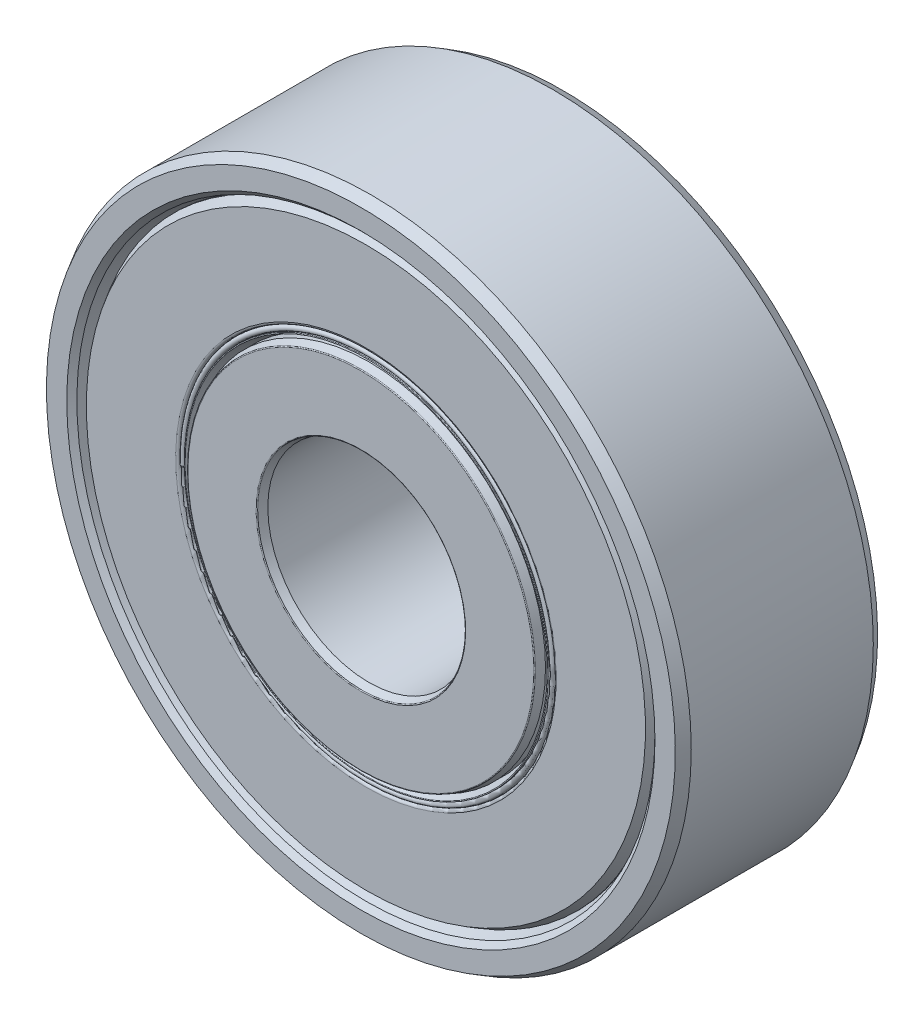
ISO-10303-21;
HEADER;
FILE_DESCRIPTION(('STEP AP214'),'2;1');
FILE_NAME('part.step','',(''),(''),'','','');
FILE_SCHEMA(('AUTOMOTIVE_DESIGN { 1 0 10303 214 1 1 1 1 }'));
ENDSEC;
DATA;
#1=APPLICATION_CONTEXT('core data for automotive mechanical design processes');
#2=APPLICATION_PROTOCOL_DEFINITION('international standard','automotive_design',2000,#1);
#3=PRODUCT_CONTEXT('',#1,'mechanical');
#4=PRODUCT('Part','Part','',(#3));
#5=PRODUCT_RELATED_PRODUCT_CATEGORY('part','',(#4));
#6=PRODUCT_DEFINITION_FORMATION('','',#4);
#7=PRODUCT_DEFINITION_CONTEXT('part definition',#1,'design');
#8=PRODUCT_DEFINITION('design','',#6,#7);
#9=PRODUCT_DEFINITION_SHAPE('','',#8);
#10=(LENGTH_UNIT() NAMED_UNIT(*) SI_UNIT(.MILLI.,.METRE.));
#11=(NAMED_UNIT(*) PLANE_ANGLE_UNIT() SI_UNIT($,.RADIAN.));
#12=(NAMED_UNIT(*) SI_UNIT($,.STERADIAN.) SOLID_ANGLE_UNIT());
#13=UNCERTAINTY_MEASURE_WITH_UNIT(LENGTH_MEASURE(1.E-05),#10,'distance_accuracy_value','');
#14=(GEOMETRIC_REPRESENTATION_CONTEXT(3) GLOBAL_UNCERTAINTY_ASSIGNED_CONTEXT((#13)) GLOBAL_UNIT_ASSIGNED_CONTEXT((#10,
#11,#12)) REPRESENTATION_CONTEXT('',''));
#15=CARTESIAN_POINT('',(0.,0.,0.));
#16=DIRECTION('',(0.,0.,1.));
#17=DIRECTION('',(1.,0.,0.));
#18=AXIS2_PLACEMENT_3D('',#15,#16,#17);
#19=CARTESIAN_POINT('',(0.,0.,3.));
#20=DIRECTION('',(0.,0.,1.));
#21=DIRECTION('',(0.,-1.,0.));
#22=AXIS2_PLACEMENT_3D('',#19,#20,#21);
#23=CYLINDRICAL_SURFACE('',#22,5.56201387559809);
#24=CARTESIAN_POINT('',(0.,0.,-2.13149306220096));
#25=DIRECTION('',(0.,0.,1.));
#26=DIRECTION('',(0.,-1.,0.));
#27=AXIS2_PLACEMENT_3D('',#24,#25,#26);
#28=CIRCLE('',#27,5.56201387559809);
#29=CARTESIAN_POINT('',(0.,-5.56201387559809,-2.13149306220096));
#30=VERTEX_POINT('',#29);
#31=EDGE_CURVE('E11',#30,#30,#28,.T.);
#32=ORIENTED_EDGE('',*,*,#31,.F.);
#33=EDGE_LOOP('',(#32));
#34=FACE_BOUND('',#33,.T.);
#35=CARTESIAN_POINT('',(0.,0.,-2.76875000000001));
#36=DIRECTION('',(0.,0.,1.));
#37=DIRECTION('',(0.,-1.,0.));
#38=AXIS2_PLACEMENT_3D('',#35,#36,#37);
#39=CIRCLE('',#38,5.56201387559809);
#40=CARTESIAN_POINT('',(0.,-5.56201387559809,-2.76875000000001));
#41=VERTEX_POINT('',#40);
#42=EDGE_CURVE('E77',#41,#41,#39,.T.);
#43=ORIENTED_EDGE('',*,*,#42,.T.);
#44=EDGE_LOOP('',(#43));
#45=FACE_BOUND('',#44,.T.);
#46=ADVANCED_FACE('F52',(#34,#45),#23,.T.);
#47=CARTESIAN_POINT('',(0.,5.56201387559809,-2.13149306220096));
#48=DIRECTION('',(0.,0.,-1.));
#49=DIRECTION('',(0.,1.,0.));
#50=AXIS2_PLACEMENT_3D('',#47,#48,#49);
#51=PLANE('',#50);
#52=CARTESIAN_POINT('',(0.,0.,-2.13149306220096));
#53=DIRECTION('',(0.,0.,1.));
#54=DIRECTION('',(0.,-1.,0.));
#55=AXIS2_PLACEMENT_3D('',#52,#53,#54);
#56=CIRCLE('',#55,5.23701387559809);
#57=CARTESIAN_POINT('',(0.,-5.23701387559809,-2.13149306220096));
#58=VERTEX_POINT('',#57);
#59=EDGE_CURVE('E58',#58,#58,#56,.T.);
#60=ORIENTED_EDGE('',*,*,#59,.F.);
#61=EDGE_LOOP('',(#60));
#62=FACE_BOUND('',#61,.T.);
#63=ORIENTED_EDGE('',*,*,#31,.T.);
#64=EDGE_LOOP('',(#63));
#65=FACE_BOUND('',#64,.T.);
#66=ADVANCED_FACE('F108',(#62,#65),#51,.F.);
#67=CARTESIAN_POINT('',(0.,0.,3.));
#68=DIRECTION('',(0.,0.,1.));
#69=DIRECTION('',(0.,-1.,0.));
#70=AXIS2_PLACEMENT_3D('',#67,#68,#69);
#71=CYLINDRICAL_SURFACE('',#70,5.23701387559809);
#72=CARTESIAN_POINT('',(0.,0.,-2.47360414663289));
#73=DIRECTION('',(0.,0.,1.));
#74=DIRECTION('',(0.,-1.,0.));
#75=AXIS2_PLACEMENT_3D('',#72,#73,#74);
#76=CIRCLE('',#75,5.23701387559809);
#77=CARTESIAN_POINT('',(0.,-5.23701387559809,-2.47360414663289));
#78=VERTEX_POINT('',#77);
#79=EDGE_CURVE('E62',#78,#78,#76,.T.);
#80=ORIENTED_EDGE('',*,*,#79,.F.);
#81=EDGE_LOOP('',(#80));
#82=FACE_BOUND('',#81,.T.);
#83=ORIENTED_EDGE('',*,*,#59,.T.);
#84=EDGE_LOOP('',(#83));
#85=FACE_BOUND('',#84,.T.);
#86=ADVANCED_FACE('F103',(#82,#85),#71,.F.);
#87=CARTESIAN_POINT('',(0.,0.,-2.47360414663289));
#88=DIRECTION('',(0.,0.,-1.));
#89=DIRECTION('',(0.,1.,0.));
#90=AXIS2_PLACEMENT_3D('',#87,#88,#89);
#91=CONICAL_SURFACE('',#90,5.23701387559809,0.349065850398866);
#92=CARTESIAN_POINT('',(0.,0.,-2.84013030214989));
#93=DIRECTION('',(0.,0.,1.));
#94=DIRECTION('',(0.,-1.,0.));
#95=AXIS2_PLACEMENT_3D('',#92,#93,#94);
#96=CIRCLE('',#95,5.3704184862863);
#97=CARTESIAN_POINT('',(0.,-5.3704184862863,-2.84013030214989));
#98=VERTEX_POINT('',#97);
#99=EDGE_CURVE('E66',#98,#98,#96,.T.);
#100=ORIENTED_EDGE('',*,*,#99,.F.);
#101=EDGE_LOOP('',(#100));
#102=FACE_BOUND('',#101,.T.);
#103=ORIENTED_EDGE('',*,*,#79,.T.);
#104=EDGE_LOOP('',(#103));
#105=FACE_BOUND('',#104,.T.);
#106=ADVANCED_FACE('F97',(#102,#105),#91,.F.);
#107=CARTESIAN_POINT('',(0.,0.,-2.835));
#108=DIRECTION('',(0.,0.,1.));
#109=DIRECTION('',(0.,-1.,0.));
#110=AXIS2_PLACEMENT_3D('',#107,#108,#109);
#111=TOROIDAL_SURFACE('',#110,5.38451387559809,0.0149999999999995);
#112=CARTESIAN_POINT('',(0.,0.,-2.835));
#113=DIRECTION('',(0.,0.,1.));
#114=DIRECTION('',(0.,-1.,0.));
#115=AXIS2_PLACEMENT_3D('',#112,#113,#114);
#116=CIRCLE('',#115,5.39951387559809);
#117=CARTESIAN_POINT('',(0.,-5.39951387559809,-2.835));
#118=VERTEX_POINT('',#117);
#119=EDGE_CURVE('E71',#118,#118,#116,.T.);
#120=ORIENTED_EDGE('',*,*,#119,.F.);
#121=EDGE_LOOP('',(#120));
#122=FACE_BOUND('',#121,.T.);
#123=ORIENTED_EDGE('',*,*,#99,.T.);
#124=EDGE_LOOP('',(#123));
#125=FACE_BOUND('',#124,.T.);
#126=ADVANCED_FACE('F91',(#122,#125),#111,.T.);
#127=CARTESIAN_POINT('',(0.,0.,3.));
#128=DIRECTION('',(0.,0.,1.));
#129=DIRECTION('',(0.,-1.,0.));
#130=AXIS2_PLACEMENT_3D('',#127,#128,#129);
#131=CYLINDRICAL_SURFACE('',#130,5.39951387559809);
#132=CARTESIAN_POINT('',(0.,0.,-2.76875000000001));
#133=DIRECTION('',(0.,0.,1.));
#134=DIRECTION('',(0.,-1.,0.));
#135=AXIS2_PLACEMENT_3D('',#132,#133,#134);
#136=CIRCLE('',#135,5.39951387559809);
#137=CARTESIAN_POINT('',(0.,-5.39951387559809,-2.76875000000001));
#138=VERTEX_POINT('',#137);
#139=EDGE_CURVE('E74',#138,#138,#136,.T.);
#140=ORIENTED_EDGE('',*,*,#139,.F.);
#141=EDGE_LOOP('',(#140));
#142=FACE_BOUND('',#141,.T.);
#143=ORIENTED_EDGE('',*,*,#119,.T.);
#144=EDGE_LOOP('',(#143));
#145=FACE_BOUND('',#144,.T.);
#146=ADVANCED_FACE('F85',(#142,#145),#131,.T.);
#147=CARTESIAN_POINT('',(0.,0.,-2.76875000000001));
#148=DIRECTION('',(0.,0.,1.));
#149=DIRECTION('',(0.,-1.,0.));
#150=AXIS2_PLACEMENT_3D('',#147,#148,#149);
#151=TOROIDAL_SURFACE('',#150,5.48076387559809,0.0812499999999997);
#152=ORIENTED_EDGE('',*,*,#42,.F.);
#153=EDGE_LOOP('',(#152));
#154=FACE_BOUND('',#153,.T.);
#155=ORIENTED_EDGE('',*,*,#139,.T.);
#156=EDGE_LOOP('',(#155));
#157=FACE_BOUND('',#156,.T.);
#158=ADVANCED_FACE('F82',(#154,#157),#151,.T.);
#159=CLOSED_SHELL('',(#46,#66,#86,#106,#126,#146,#158));
#160=MANIFOLD_SOLID_BREP('B2',#159);
#161=CARTESIAN_POINT('',(0.,5.56201387559809,2.13149306220096));
#162=DIRECTION('',(0.,0.,1.));
#163=DIRECTION('',(0.,-1.,0.));
#164=AXIS2_PLACEMENT_3D('',#161,#162,#163);
#165=PLANE('',#164);
#166=CARTESIAN_POINT('',(0.,0.,2.13149306220096));
#167=DIRECTION('',(0.,0.,1.));
#168=DIRECTION('',(0.,-1.,0.));
#169=AXIS2_PLACEMENT_3D('',#166,#167,#168);
#170=CIRCLE('',#169,5.56201387559809);
#171=CARTESIAN_POINT('',(0.,-5.56201387559809,2.13149306220095));
#172=VERTEX_POINT('',#171);
#173=EDGE_CURVE('E178',#172,#172,#170,.T.);
#174=ORIENTED_EDGE('',*,*,#173,.F.);
#175=EDGE_LOOP('',(#174));
#176=FACE_BOUND('',#175,.T.);
#177=CARTESIAN_POINT('',(0.,0.,2.13149306220096));
#178=DIRECTION('',(0.,0.,1.));
#179=DIRECTION('',(0.,-1.,0.));
#180=AXIS2_PLACEMENT_3D('',#177,#178,#179);
#181=CIRCLE('',#180,5.23701387559809);
#182=CARTESIAN_POINT('',(0.,-5.23701387559809,2.13149306220095));
#183=VERTEX_POINT('',#182);
#184=EDGE_CURVE('E51',#183,#183,#181,.T.);
#185=ORIENTED_EDGE('',*,*,#184,.T.);
#186=EDGE_LOOP('',(#185));
#187=FACE_BOUND('',#186,.T.);
#188=ADVANCED_FACE('F153',(#176,#187),#165,.F.);
#189=CARTESIAN_POINT('',(0.,0.,3.));
#190=DIRECTION('',(0.,0.,1.));
#191=DIRECTION('',(0.,-1.,0.));
#192=AXIS2_PLACEMENT_3D('',#189,#190,#191);
#193=CYLINDRICAL_SURFACE('',#192,5.23701387559809);
#194=ORIENTED_EDGE('',*,*,#184,.F.);
#195=EDGE_LOOP('',(#194));
#196=FACE_BOUND('',#195,.T.);
#197=CARTESIAN_POINT('',(0.,0.,2.47360414663289));
#198=DIRECTION('',(0.,0.,1.));
#199=DIRECTION('',(0.,-1.,0.));
#200=AXIS2_PLACEMENT_3D('',#197,#198,#199);
#201=CIRCLE('',#200,5.23701387559809);
#202=CARTESIAN_POINT('',(0.,-5.23701387559809,2.47360414663289));
#203=VERTEX_POINT('',#202);
#204=EDGE_CURVE('E159',#203,#203,#201,.T.);
#205=ORIENTED_EDGE('',*,*,#204,.T.);
#206=EDGE_LOOP('',(#205));
#207=FACE_BOUND('',#206,.T.);
#208=ADVANCED_FACE('F185',(#196,#207),#193,.F.);
#209=CARTESIAN_POINT('',(0.,0.,2.84013030214989));
#210=DIRECTION('',(0.,0.,1.));
#211=DIRECTION('',(0.,-1.,0.));
#212=AXIS2_PLACEMENT_3D('',#209,#210,#211);
#213=CONICAL_SURFACE('',#212,5.3704184862863,0.349065850398866);
#214=ORIENTED_EDGE('',*,*,#204,.F.);
#215=EDGE_LOOP('',(#214));
#216=FACE_BOUND('',#215,.T.);
#217=CARTESIAN_POINT('',(0.,0.,2.84013030214989));
#218=DIRECTION('',(0.,0.,1.));
#219=DIRECTION('',(0.,-1.,0.));
#220=AXIS2_PLACEMENT_3D('',#217,#218,#219);
#221=CIRCLE('',#220,5.3704184862863);
#222=CARTESIAN_POINT('',(0.,-5.3704184862863,2.84013030214989));
#223=VERTEX_POINT('',#222);
#224=EDGE_CURVE('E163',#223,#223,#221,.T.);
#225=ORIENTED_EDGE('',*,*,#224,.T.);
#226=EDGE_LOOP('',(#225));
#227=FACE_BOUND('',#226,.T.);
#228=ADVANCED_FACE('F189',(#216,#227),#213,.F.);
#229=CARTESIAN_POINT('',(0.,0.,2.835));
#230=DIRECTION('',(0.,0.,1.));
#231=DIRECTION('',(0.,-1.,0.));
#232=AXIS2_PLACEMENT_3D('',#229,#230,#231);
#233=TOROIDAL_SURFACE('',#232,5.38451387559809,0.0149999999999995);
#234=ORIENTED_EDGE('',*,*,#224,.F.);
#235=EDGE_LOOP('',(#234));
#236=FACE_BOUND('',#235,.T.);
#237=CARTESIAN_POINT('',(0.,0.,2.835));
#238=DIRECTION('',(0.,0.,1.));
#239=DIRECTION('',(0.,-1.,0.));
#240=AXIS2_PLACEMENT_3D('',#237,#238,#239);
#241=CIRCLE('',#240,5.39951387559809);
#242=CARTESIAN_POINT('',(0.,-5.39951387559809,2.835));
#243=VERTEX_POINT('',#242);
#244=EDGE_CURVE('E167',#243,#243,#241,.T.);
#245=ORIENTED_EDGE('',*,*,#244,.T.);
#246=EDGE_LOOP('',(#245));
#247=FACE_BOUND('',#246,.T.);
#248=ADVANCED_FACE('F194',(#236,#247),#233,.T.);
#249=CARTESIAN_POINT('',(0.,0.,3.));
#250=DIRECTION('',(0.,0.,1.));
#251=DIRECTION('',(0.,-1.,0.));
#252=AXIS2_PLACEMENT_3D('',#249,#250,#251);
#253=CYLINDRICAL_SURFACE('',#252,5.39951387559809);
#254=ORIENTED_EDGE('',*,*,#244,.F.);
#255=EDGE_LOOP('',(#254));
#256=FACE_BOUND('',#255,.T.);
#257=CARTESIAN_POINT('',(0.,0.,2.76875));
#258=DIRECTION('',(0.,0.,1.));
#259=DIRECTION('',(0.,-1.,0.));
#260=AXIS2_PLACEMENT_3D('',#257,#258,#259);
#261=CIRCLE('',#260,5.39951387559809);
#262=CARTESIAN_POINT('',(0.,-5.39951387559809,2.76875));
#263=VERTEX_POINT('',#262);
#264=EDGE_CURVE('E172',#263,#263,#261,.T.);
#265=ORIENTED_EDGE('',*,*,#264,.T.);
#266=EDGE_LOOP('',(#265));
#267=FACE_BOUND('',#266,.T.);
#268=ADVANCED_FACE('F200',(#256,#267),#253,.T.);
#269=CARTESIAN_POINT('',(0.,0.,2.76875));
#270=DIRECTION('',(0.,0.,1.));
#271=DIRECTION('',(0.,-1.,0.));
#272=AXIS2_PLACEMENT_3D('',#269,#270,#271);
#273=TOROIDAL_SURFACE('',#272,5.48076387559809,0.0812499999999997);
#274=ORIENTED_EDGE('',*,*,#264,.F.);
#275=EDGE_LOOP('',(#274));
#276=FACE_BOUND('',#275,.T.);
#277=CARTESIAN_POINT('',(0.,0.,2.76875));
#278=DIRECTION('',(0.,0.,1.));
#279=DIRECTION('',(0.,-1.,0.));
#280=AXIS2_PLACEMENT_3D('',#277,#278,#279);
#281=CIRCLE('',#280,5.56201387559809);
#282=CARTESIAN_POINT('',(0.,-5.56201387559809,2.76875));
#283=VERTEX_POINT('',#282);
#284=EDGE_CURVE('E175',#283,#283,#281,.T.);
#285=ORIENTED_EDGE('',*,*,#284,.T.);
#286=EDGE_LOOP('',(#285));
#287=FACE_BOUND('',#286,.T.);
#288=ADVANCED_FACE('F204',(#276,#287),#273,.T.);
#289=CARTESIAN_POINT('',(0.,0.,3.));
#290=DIRECTION('',(0.,0.,1.));
#291=DIRECTION('',(0.,-1.,0.));
#292=AXIS2_PLACEMENT_3D('',#289,#290,#291);
#293=CYLINDRICAL_SURFACE('',#292,5.56201387559809);
#294=ORIENTED_EDGE('',*,*,#284,.F.);
#295=EDGE_LOOP('',(#294));
#296=FACE_BOUND('',#295,.T.);
#297=ORIENTED_EDGE('',*,*,#173,.T.);
#298=EDGE_LOOP('',(#297));
#299=FACE_BOUND('',#298,.T.);
#300=ADVANCED_FACE('F182',(#296,#299),#293,.T.);
#301=CLOSED_SHELL('',(#188,#208,#228,#248,#268,#288,#300));
#302=MANIFOLD_SOLID_BREP('B6',#301);
#303=CARTESIAN_POINT('',(0.,0.,-2.85));
#304=DIRECTION('',(0.,0.,1.));
#305=DIRECTION('',(0.,-1.,0.));
#306=AXIS2_PLACEMENT_3D('',#303,#304,#305);
#307=CONICAL_SURFACE('',#306,8.2925,0.523598775598293);
#308=CARTESIAN_POINT('',(0.,0.,-2.56854174377006));
#309=DIRECTION('',(0.,0.,1.));
#310=DIRECTION('',(0.,-1.,0.));
#311=AXIS2_PLACEMENT_3D('',#308,#309,#310);
#312=CIRCLE('',#311,8.455);
#313=CARTESIAN_POINT('',(0.,-8.455,-2.56854174377006));
#314=VERTEX_POINT('',#313);
#315=EDGE_CURVE('E276',#314,#314,#312,.T.);
#316=ORIENTED_EDGE('',*,*,#315,.F.);
#317=EDGE_LOOP('',(#316));
#318=FACE_BOUND('',#317,.T.);
#319=CARTESIAN_POINT('',(0.,0.,-2.85));
#320=DIRECTION('',(0.,0.,1.));
#321=DIRECTION('',(0.,-1.,0.));
#322=AXIS2_PLACEMENT_3D('',#319,#320,#321);
#323=CIRCLE('',#322,8.2925);
#324=CARTESIAN_POINT('',(0.,-8.2925,-2.85000000000001));
#325=VERTEX_POINT('',#324);
#326=EDGE_CURVE('E152',#325,#325,#323,.T.);
#327=ORIENTED_EDGE('',*,*,#326,.T.);
#328=EDGE_LOOP('',(#327));
#329=FACE_BOUND('',#328,.T.);
#330=ADVANCED_FACE('F254',(#318,#329),#307,.T.);
#331=CARTESIAN_POINT('',(0.,8.2925,-2.85));
#332=DIRECTION('',(0.,0.,1.));
#333=DIRECTION('',(0.,-1.,0.));
#334=AXIS2_PLACEMENT_3D('',#331,#332,#333);
#335=PLANE('',#334);
#336=ORIENTED_EDGE('',*,*,#326,.F.);
#337=EDGE_LOOP('',(#336));
#338=FACE_BOUND('',#337,.T.);
#339=CARTESIAN_POINT('',(0.,0.,-2.85));
#340=DIRECTION('',(0.,0.,1.));
#341=DIRECTION('',(0.,-1.,0.));
#342=AXIS2_PLACEMENT_3D('',#339,#340,#341);
#343=CIRCLE('',#342,5.64326387559809);
#344=CARTESIAN_POINT('',(0.,-5.64326387559809,-2.85000000000001));
#345=VERTEX_POINT('',#344);
#346=EDGE_CURVE('E260',#345,#345,#343,.T.);
#347=ORIENTED_EDGE('',*,*,#346,.T.);
#348=EDGE_LOOP('',(#347));
#349=FACE_BOUND('',#348,.T.);
#350=ADVANCED_FACE('F283',(#338,#349),#335,.F.);
#351=CARTESIAN_POINT('',(0.,0.,-2.76875));
#352=DIRECTION('',(0.,0.,1.));
#353=DIRECTION('',(0.,-1.,0.));
#354=AXIS2_PLACEMENT_3D('',#351,#352,#353);
#355=TOROIDAL_SURFACE('',#354,5.64326387559809,0.0812500000000008);
#356=ORIENTED_EDGE('',*,*,#346,.F.);
#357=EDGE_LOOP('',(#356));
#358=FACE_BOUND('',#357,.T.);
#359=CARTESIAN_POINT('',(0.,0.,-2.76875));
#360=DIRECTION('',(0.,0.,1.));
#361=DIRECTION('',(0.,-1.,0.));
#362=AXIS2_PLACEMENT_3D('',#359,#360,#361);
#363=CIRCLE('',#362,5.56201387559809);
#364=CARTESIAN_POINT('',(0.,-5.56201387559809,-2.76875));
#365=VERTEX_POINT('',#364);
#366=EDGE_CURVE('E264',#365,#365,#363,.T.);
#367=ORIENTED_EDGE('',*,*,#366,.T.);
#368=EDGE_LOOP('',(#367));
#369=FACE_BOUND('',#368,.T.);
#370=ADVANCED_FACE('F287',(#358,#369),#355,.T.);
#371=CARTESIAN_POINT('',(0.,0.,3.));
#372=DIRECTION('',(0.,0.,1.));
#373=DIRECTION('',(0.,-1.,0.));
#374=AXIS2_PLACEMENT_3D('',#371,#372,#373);
#375=CYLINDRICAL_SURFACE('',#374,5.56201387559809);
#376=ORIENTED_EDGE('',*,*,#366,.F.);
#377=EDGE_LOOP('',(#376));
#378=FACE_BOUND('',#377,.T.);
#379=CARTESIAN_POINT('',(0.,0.,-2.13149306220096));
#380=DIRECTION('',(0.,0.,1.));
#381=DIRECTION('',(0.,-1.,0.));
#382=AXIS2_PLACEMENT_3D('',#379,#380,#381);
#383=CIRCLE('',#382,5.56201387559809);
#384=CARTESIAN_POINT('',(0.,-5.56201387559809,-2.13149306220096));
#385=VERTEX_POINT('',#384);
#386=EDGE_CURVE('E268',#385,#385,#383,.T.);
#387=ORIENTED_EDGE('',*,*,#386,.T.);
#388=EDGE_LOOP('',(#387));
#389=FACE_BOUND('',#388,.T.);
#390=ADVANCED_FACE('F292',(#378,#389),#375,.F.);
#391=CARTESIAN_POINT('',(0.,8.455,-2.13149306220096));
#392=DIRECTION('',(0.,0.,-1.));
#393=DIRECTION('',(0.,1.,0.));
#394=AXIS2_PLACEMENT_3D('',#391,#392,#393);
#395=PLANE('',#394);
#396=ORIENTED_EDGE('',*,*,#386,.F.);
#397=EDGE_LOOP('',(#396));
#398=FACE_BOUND('',#397,.T.);
#399=CARTESIAN_POINT('',(0.,0.,-2.13149306220096));
#400=DIRECTION('',(0.,0.,1.));
#401=DIRECTION('',(0.,-1.,0.));
#402=AXIS2_PLACEMENT_3D('',#399,#400,#401);
#403=CIRCLE('',#402,8.455);
#404=CARTESIAN_POINT('',(0.,-8.455,-2.13149306220096));
#405=VERTEX_POINT('',#404);
#406=EDGE_CURVE('E273',#405,#405,#403,.T.);
#407=ORIENTED_EDGE('',*,*,#406,.T.);
#408=EDGE_LOOP('',(#407));
#409=FACE_BOUND('',#408,.T.);
#410=ADVANCED_FACE('F298',(#398,#409),#395,.F.);
#411=CARTESIAN_POINT('',(0.,0.,3.));
#412=DIRECTION('',(0.,0.,1.));
#413=DIRECTION('',(0.,-1.,0.));
#414=AXIS2_PLACEMENT_3D('',#411,#412,#413);
#415=CYLINDRICAL_SURFACE('',#414,8.455);
#416=ORIENTED_EDGE('',*,*,#406,.F.);
#417=EDGE_LOOP('',(#416));
#418=FACE_BOUND('',#417,.T.);
#419=ORIENTED_EDGE('',*,*,#315,.T.);
#420=EDGE_LOOP('',(#419));
#421=FACE_BOUND('',#420,.T.);
#422=ADVANCED_FACE('F280',(#418,#421),#415,.T.);
#423=CLOSED_SHELL('',(#330,#350,#370,#390,#410,#422));
#424=MANIFOLD_SOLID_BREP('B46',#423);
#425=CARTESIAN_POINT('',(0.,8.455,2.13149306220096));
#426=DIRECTION('',(0.,0.,1.));
#427=DIRECTION('',(0.,-1.,0.));
#428=AXIS2_PLACEMENT_3D('',#425,#426,#427);
#429=PLANE('',#428);
#430=CARTESIAN_POINT('',(0.,0.,2.13149306220095));
#431=DIRECTION('',(0.,0.,1.));
#432=DIRECTION('',(0.,-1.,0.));
#433=AXIS2_PLACEMENT_3D('',#430,#431,#432);
#434=CIRCLE('',#433,8.455);
#435=CARTESIAN_POINT('',(0.,-8.455,2.13149306220095));
#436=VERTEX_POINT('',#435);
#437=EDGE_CURVE('E253',#436,#436,#434,.T.);
#438=ORIENTED_EDGE('',*,*,#437,.F.);
#439=EDGE_LOOP('',(#438));
#440=FACE_BOUND('',#439,.T.);
#441=CARTESIAN_POINT('',(0.,0.,2.13149306220095));
#442=DIRECTION('',(0.,0.,1.));
#443=DIRECTION('',(0.,-1.,0.));
#444=AXIS2_PLACEMENT_3D('',#441,#442,#443);
#445=CIRCLE('',#444,5.56201387559809);
#446=CARTESIAN_POINT('',(0.,-5.56201387559809,2.13149306220095));
#447=VERTEX_POINT('',#446);
#448=EDGE_CURVE('E362',#447,#447,#445,.T.);
#449=ORIENTED_EDGE('',*,*,#448,.T.);
#450=EDGE_LOOP('',(#449));
#451=FACE_BOUND('',#450,.T.);
#452=ADVANCED_FACE('F340',(#440,#451),#429,.F.);
#453=CARTESIAN_POINT('',(0.,0.,3.));
#454=DIRECTION('',(0.,0.,1.));
#455=DIRECTION('',(0.,-1.,0.));
#456=AXIS2_PLACEMENT_3D('',#453,#454,#455);
#457=CYLINDRICAL_SURFACE('',#456,8.455);
#458=CARTESIAN_POINT('',(0.,0.,2.56854174377005));
#459=DIRECTION('',(0.,0.,1.));
#460=DIRECTION('',(0.,-1.,0.));
#461=AXIS2_PLACEMENT_3D('',#458,#459,#460);
#462=CIRCLE('',#461,8.455);
#463=CARTESIAN_POINT('',(0.,-8.455,2.56854174377005));
#464=VERTEX_POINT('',#463);
#465=EDGE_CURVE('E346',#464,#464,#462,.T.);
#466=ORIENTED_EDGE('',*,*,#465,.F.);
#467=EDGE_LOOP('',(#466));
#468=FACE_BOUND('',#467,.T.);
#469=ORIENTED_EDGE('',*,*,#437,.T.);
#470=EDGE_LOOP('',(#469));
#471=FACE_BOUND('',#470,.T.);
#472=ADVANCED_FACE('F387',(#468,#471),#457,.T.);
#473=CARTESIAN_POINT('',(0.,0.,2.56854174377005));
#474=DIRECTION('',(0.,0.,-1.));
#475=DIRECTION('',(0.,1.,0.));
#476=AXIS2_PLACEMENT_3D('',#473,#474,#475);
#477=CONICAL_SURFACE('',#476,8.455,0.523598775598292);
#478=CARTESIAN_POINT('',(0.,0.,2.85));
#479=DIRECTION('',(0.,0.,1.));
#480=DIRECTION('',(0.,-1.,0.));
#481=AXIS2_PLACEMENT_3D('',#478,#479,#480);
#482=CIRCLE('',#481,8.2925);
#483=CARTESIAN_POINT('',(0.,-8.2925,2.85));
#484=VERTEX_POINT('',#483);
#485=EDGE_CURVE('E350',#484,#484,#482,.T.);
#486=ORIENTED_EDGE('',*,*,#485,.F.);
#487=EDGE_LOOP('',(#486));
#488=FACE_BOUND('',#487,.T.);
#489=ORIENTED_EDGE('',*,*,#465,.T.);
#490=EDGE_LOOP('',(#489));
#491=FACE_BOUND('',#490,.T.);
#492=ADVANCED_FACE('F382',(#488,#491),#477,.T.);
#493=CARTESIAN_POINT('',(0.,8.2925,2.85));
#494=DIRECTION('',(0.,0.,-1.));
#495=DIRECTION('',(0.,1.,0.));
#496=AXIS2_PLACEMENT_3D('',#493,#494,#495);
#497=PLANE('',#496);
#498=CARTESIAN_POINT('',(0.,0.,2.85));
#499=DIRECTION('',(0.,0.,1.));
#500=DIRECTION('',(0.,-1.,0.));
#501=AXIS2_PLACEMENT_3D('',#498,#499,#500);
#502=CIRCLE('',#501,5.64326387559809);
#503=CARTESIAN_POINT('',(0.,-5.64326387559809,2.85));
#504=VERTEX_POINT('',#503);
#505=EDGE_CURVE('E354',#504,#504,#502,.T.);
#506=ORIENTED_EDGE('',*,*,#505,.F.);
#507=EDGE_LOOP('',(#506));
#508=FACE_BOUND('',#507,.T.);
#509=ORIENTED_EDGE('',*,*,#485,.T.);
#510=EDGE_LOOP('',(#509));
#511=FACE_BOUND('',#510,.T.);
#512=ADVANCED_FACE('F376',(#508,#511),#497,.F.);
#513=CARTESIAN_POINT('',(0.,0.,2.76875));
#514=DIRECTION('',(0.,0.,1.));
#515=DIRECTION('',(0.,-1.,0.));
#516=AXIS2_PLACEMENT_3D('',#513,#514,#515);
#517=TOROIDAL_SURFACE('',#516,5.64326387559809,0.0812500000000008);
#518=CARTESIAN_POINT('',(0.,0.,2.76875));
#519=DIRECTION('',(0.,0.,1.));
#520=DIRECTION('',(0.,-1.,0.));
#521=AXIS2_PLACEMENT_3D('',#518,#519,#520);
#522=CIRCLE('',#521,5.56201387559809);
#523=CARTESIAN_POINT('',(0.,-5.56201387559809,2.76875));
#524=VERTEX_POINT('',#523);
#525=EDGE_CURVE('E359',#524,#524,#522,.T.);
#526=ORIENTED_EDGE('',*,*,#525,.F.);
#527=EDGE_LOOP('',(#526));
#528=FACE_BOUND('',#527,.T.);
#529=ORIENTED_EDGE('',*,*,#505,.T.);
#530=EDGE_LOOP('',(#529));
#531=FACE_BOUND('',#530,.T.);
#532=ADVANCED_FACE('F370',(#528,#531),#517,.T.);
#533=CARTESIAN_POINT('',(0.,0.,3.));
#534=DIRECTION('',(0.,0.,1.));
#535=DIRECTION('',(0.,-1.,0.));
#536=AXIS2_PLACEMENT_3D('',#533,#534,#535);
#537=CYLINDRICAL_SURFACE('',#536,5.56201387559809);
#538=ORIENTED_EDGE('',*,*,#448,.F.);
#539=EDGE_LOOP('',(#538));
#540=FACE_BOUND('',#539,.T.);
#541=ORIENTED_EDGE('',*,*,#525,.T.);
#542=EDGE_LOOP('',(#541));
#543=FACE_BOUND('',#542,.T.);
#544=ADVANCED_FACE('F367',(#540,#543),#537,.F.);
#545=CLOSED_SHELL('',(#452,#472,#492,#512,#532,#544));
#546=MANIFOLD_SOLID_BREP('B147',#545);
#547=CARTESIAN_POINT('',(-5.92881592261845,3.42300346889959,0.));
#548=DIRECTION('',(0.,0.,1.));
#549=DIRECTION('',(-0.866025403784433,0.50000000000001,0.));
#550=AXIS2_PLACEMENT_3D('',#547,#548,#549);
#551=SPHERICAL_SURFACE('',#550,2.13149306220096);
#552=CARTESIAN_POINT('',(-5.92881592261845,3.42300346889959,2.13149306220095));
#553=VERTEX_POINT('',#552);
#554=VERTEX_LOOP('',#553);
#555=FACE_BOUND('',#554,.T.);
#556=ADVANCED_FACE('F447',(#555),#551,.T.);
#557=CLOSED_SHELL('',(#556));
#558=MANIFOLD_SOLID_BREP('B248',#557);
#559=CARTESIAN_POINT('',(-5.92881592261852,-3.42300346889947,0.));
#560=DIRECTION('',(0.,0.,1.));
#561=DIRECTION('',(-0.866025403784443,-0.499999999999992,0.));
#562=AXIS2_PLACEMENT_3D('',#559,#560,#561);
#563=SPHERICAL_SURFACE('',#562,2.13149306220096);
#564=CARTESIAN_POINT('',(-5.92881592261852,-3.42300346889947,2.13149306220095));
#565=VERTEX_POINT('',#564);
#566=VERTEX_LOOP('',#565);
#567=FACE_BOUND('',#566,.T.);
#568=ADVANCED_FACE('F464',(#567),#563,.T.);
#569=CLOSED_SHELL('',(#568));
#570=MANIFOLD_SOLID_BREP('B336',#569);
#571=CARTESIAN_POINT('',(0.,-6.84600693779904,0.));
#572=DIRECTION('',(0.,0.,1.));
#573=DIRECTION('',(0.,-1.,0.));
#574=AXIS2_PLACEMENT_3D('',#571,#572,#573);
#575=SPHERICAL_SURFACE('',#574,2.13149306220096);
#576=CARTESIAN_POINT('',(0.,-6.84600693779905,2.13149306220095));
#577=VERTEX_POINT('',#576);
#578=VERTEX_LOOP('',#577);
#579=FACE_BOUND('',#578,.T.);
#580=ADVANCED_FACE('F481',(#579),#575,.T.);
#581=CLOSED_SHELL('',(#580));
#582=MANIFOLD_SOLID_BREP('B443',#581);
#583=CARTESIAN_POINT('',(5.92881592261847,-3.42300346889955,0.));
#584=DIRECTION('',(0.,0.,1.));
#585=DIRECTION('',(0.866025403784436,-0.500000000000004,0.));
#586=AXIS2_PLACEMENT_3D('',#583,#584,#585);
#587=SPHERICAL_SURFACE('',#586,2.13149306220096);
#588=CARTESIAN_POINT('',(5.92881592261847,-3.42300346889955,2.13149306220095));
#589=VERTEX_POINT('',#588);
#590=VERTEX_LOOP('',#589);
#591=FACE_BOUND('',#590,.T.);
#592=ADVANCED_FACE('F498',(#591),#587,.T.);
#593=CLOSED_SHELL('',(#592));
#594=MANIFOLD_SOLID_BREP('B460',#593);
#595=CARTESIAN_POINT('',(5.92881592261849,3.42300346889951,0.));
#596=DIRECTION('',(0.,0.,1.));
#597=DIRECTION('',(0.86602540378444,0.499999999999998,0.));
#598=AXIS2_PLACEMENT_3D('',#595,#596,#597);
#599=SPHERICAL_SURFACE('',#598,2.13149306220096);
#600=CARTESIAN_POINT('',(5.92881592261849,3.42300346889951,2.13149306220095));
#601=VERTEX_POINT('',#600);
#602=VERTEX_LOOP('',#601);
#603=FACE_BOUND('',#602,.T.);
#604=ADVANCED_FACE('F515',(#603),#599,.T.);
#605=CLOSED_SHELL('',(#604));
#606=MANIFOLD_SOLID_BREP('B477',#605);
#607=CARTESIAN_POINT('',(0.,6.84600693779904,0.));
#608=DIRECTION('',(0.,0.,1.));
#609=DIRECTION('',(0.,1.,0.));
#610=AXIS2_PLACEMENT_3D('',#607,#608,#609);
#611=SPHERICAL_SURFACE('',#610,2.13149306220096);
#612=CARTESIAN_POINT('',(0.,6.84600693779904,2.13149306220096));
#613=VERTEX_POINT('',#612);
#614=VERTEX_LOOP('',#613);
#615=FACE_BOUND('',#614,.T.);
#616=ADVANCED_FACE('F534',(#615),#611,.T.);
#617=CLOSED_SHELL('',(#616));
#618=MANIFOLD_SOLID_BREP('B494',#617);
#619=CARTESIAN_POINT('',(0.,0.,-2.97));
#620=DIRECTION('',(0.,0.,1.));
#621=DIRECTION('',(0.,-1.,0.));
#622=AXIS2_PLACEMENT_3D('',#619,#620,#621);
#623=TOROIDAL_SURFACE('',#622,3.10835908237018,0.0299999999999997);
#624=CARTESIAN_POINT('',(0.,0.,-3.));
#625=DIRECTION('',(0.,0.,1.));
#626=DIRECTION('',(0.,-1.,0.));
#627=AXIS2_PLACEMENT_3D('',#624,#625,#626);
#628=CIRCLE('',#627,3.10835908237018);
#629=CARTESIAN_POINT('',(0.,-3.10835908237017,-3.));
#630=VERTEX_POINT('',#629);
#631=EDGE_CURVE('E533',#630,#630,#628,.T.);
#632=ORIENTED_EDGE('',*,*,#631,.F.);
#633=EDGE_LOOP('',(#632));
#634=FACE_BOUND('',#633,.T.);
#635=CARTESIAN_POINT('',(0.,0.,-2.98026060429977));
#636=DIRECTION('',(0.,0.,1.));
#637=DIRECTION('',(0.,-1.,0.));
#638=AXIS2_PLACEMENT_3D('',#635,#636,#637);
#639=CIRCLE('',#638,3.0801683037466);
#640=CARTESIAN_POINT('',(0.,-3.0801683037466,-2.98026060429977));
#641=VERTEX_POINT('',#640);
#642=EDGE_CURVE('E611',#641,#641,#639,.T.);
#643=ORIENTED_EDGE('',*,*,#642,.T.);
#644=EDGE_LOOP('',(#643));
#645=FACE_BOUND('',#644,.T.);
#646=ADVANCED_FACE('F552',(#634,#645),#623,.T.);
#647=CARTESIAN_POINT('',(0.,3.10835908237018,-3.));
#648=DIRECTION('',(0.,0.,1.));
#649=DIRECTION('',(0.,-1.,0.));
#650=AXIS2_PLACEMENT_3D('',#647,#648,#649);
#651=PLANE('',#650);
#652=CARTESIAN_POINT('',(0.,0.,-3.));
#653=DIRECTION('',(0.,0.,1.));
#654=DIRECTION('',(0.,-1.,0.));
#655=AXIS2_PLACEMENT_3D('',#652,#653,#654);
#656=CIRCLE('',#655,5.12865479322791);
#657=CARTESIAN_POINT('',(0.,-5.12865479322791,-3.));
#658=VERTEX_POINT('',#657);
#659=EDGE_CURVE('E559',#658,#658,#656,.T.);
#660=ORIENTED_EDGE('',*,*,#659,.F.);
#661=EDGE_LOOP('',(#660));
#662=FACE_BOUND('',#661,.T.);
#663=ORIENTED_EDGE('',*,*,#631,.T.);
#664=EDGE_LOOP('',(#663));
#665=FACE_BOUND('',#664,.T.);
#666=ADVANCED_FACE('F685',(#662,#665),#651,.F.);
#667=CARTESIAN_POINT('',(0.,0.,-2.97));
#668=DIRECTION('',(0.,0.,1.));
#669=DIRECTION('',(0.,-1.,0.));
#670=AXIS2_PLACEMENT_3D('',#667,#668,#669);
#671=TOROIDAL_SURFACE('',#670,5.12865479322791,0.0299999999999997);
#672=CARTESIAN_POINT('',(0.,0.,-2.98026060429977));
#673=DIRECTION('',(0.,0.,1.));
#674=DIRECTION('',(0.,-1.,0.));
#675=AXIS2_PLACEMENT_3D('',#672,#673,#674);
#676=CIRCLE('',#675,5.15684557185149);
#677=CARTESIAN_POINT('',(0.,-5.15684557185149,-2.98026060429977));
#678=VERTEX_POINT('',#677);
#679=EDGE_CURVE('E564',#678,#678,#676,.T.);
#680=ORIENTED_EDGE('',*,*,#679,.F.);
#681=EDGE_LOOP('',(#680));
#682=FACE_BOUND('',#681,.T.);
#683=ORIENTED_EDGE('',*,*,#659,.T.);
#684=EDGE_LOOP('',(#683));
#685=FACE_BOUND('',#684,.T.);
#686=ADVANCED_FACE('F680',(#682,#685),#671,.T.);
#687=CARTESIAN_POINT('',(0.,0.,-2.98026060429977));
#688=DIRECTION('',(0.,0.,1.));
#689=DIRECTION('',(0.,-1.,0.));
#690=AXIS2_PLACEMENT_3D('',#687,#688,#689);
#691=CONICAL_SURFACE('',#690,5.15684557185149,0.349065850398866);
#692=CARTESIAN_POINT('',(0.,0.,-2.76));
#693=DIRECTION('',(0.,0.,1.));
#694=DIRECTION('',(0.,-1.,0.));
#695=AXIS2_PLACEMENT_3D('',#692,#693,#694);
#696=CIRCLE('',#695,5.23701387559809);
#697=CARTESIAN_POINT('',(0.,-5.23701387559809,-2.76));
#698=VERTEX_POINT('',#697);
#699=EDGE_CURVE('E569',#698,#698,#696,.T.);
#700=ORIENTED_EDGE('',*,*,#699,.F.);
#701=EDGE_LOOP('',(#700));
#702=FACE_BOUND('',#701,.T.);
#703=ORIENTED_EDGE('',*,*,#679,.T.);
#704=EDGE_LOOP('',(#703));
#705=FACE_BOUND('',#704,.T.);
#706=ADVANCED_FACE('F674',(#702,#705),#691,.T.);
#707=CARTESIAN_POINT('',(0.,0.,3.));
#708=DIRECTION('',(0.,0.,1.));
#709=DIRECTION('',(0.,-1.,0.));
#710=AXIS2_PLACEMENT_3D('',#707,#708,#709);
#711=CYLINDRICAL_SURFACE('',#710,5.23701387559809);
#712=CARTESIAN_POINT('',(0.,0.,-1.398));
#713=DIRECTION('',(0.,0.,1.));
#714=DIRECTION('',(0.,-1.,0.));
#715=AXIS2_PLACEMENT_3D('',#712,#713,#714);
#716=CIRCLE('',#715,5.23701387559809);
#717=CARTESIAN_POINT('',(0.,-5.23701387559809,-1.398));
#718=VERTEX_POINT('',#717);
#719=EDGE_CURVE('E575',#718,#718,#716,.T.);
#720=ORIENTED_EDGE('',*,*,#719,.F.);
#721=EDGE_LOOP('',(#720));
#722=FACE_BOUND('',#721,.T.);
#723=ORIENTED_EDGE('',*,*,#699,.T.);
#724=EDGE_LOOP('',(#723));
#725=FACE_BOUND('',#724,.T.);
#726=ADVANCED_FACE('F668',(#722,#725),#711,.T.);
#727=CARTESIAN_POINT('',(0.,0.,0.));
#728=DIRECTION('',(0.,0.,1.));
#729=DIRECTION('',(0.,-1.,0.));
#730=AXIS2_PLACEMENT_3D('',#727,#728,#729);
#731=TOROIDAL_SURFACE('',#730,6.84600693779904,2.13149306220096);
#732=CARTESIAN_POINT('',(0.,0.,1.398));
#733=DIRECTION('',(0.,0.,1.));
#734=DIRECTION('',(0.,-1.,0.));
#735=AXIS2_PLACEMENT_3D('',#732,#733,#734);
#736=CIRCLE('',#735,5.23701387559809);
#737=CARTESIAN_POINT('',(0.,-5.23701387559809,1.398));
#738=VERTEX_POINT('',#737);
#739=EDGE_CURVE('E579',#738,#738,#736,.T.);
#740=ORIENTED_EDGE('',*,*,#739,.F.);
#741=EDGE_LOOP('',(#740));
#742=FACE_BOUND('',#741,.T.);
#743=ORIENTED_EDGE('',*,*,#719,.T.);
#744=EDGE_LOOP('',(#743));
#745=FACE_BOUND('',#744,.T.);
#746=ADVANCED_FACE('F662',(#742,#745),#731,.F.);
#747=CARTESIAN_POINT('',(0.,0.,3.));
#748=DIRECTION('',(0.,0.,1.));
#749=DIRECTION('',(0.,-1.,0.));
#750=AXIS2_PLACEMENT_3D('',#747,#748,#749);
#751=CYLINDRICAL_SURFACE('',#750,5.23701387559809);
#752=CARTESIAN_POINT('',(0.,0.,2.76));
#753=DIRECTION('',(0.,0.,1.));
#754=DIRECTION('',(0.,-1.,0.));
#755=AXIS2_PLACEMENT_3D('',#752,#753,#754);
#756=CIRCLE('',#755,5.23701387559809);
#757=CARTESIAN_POINT('',(0.,-5.23701387559809,2.76));
#758=VERTEX_POINT('',#757);
#759=EDGE_CURVE('E583',#758,#758,#756,.T.);
#760=ORIENTED_EDGE('',*,*,#759,.F.);
#761=EDGE_LOOP('',(#760));
#762=FACE_BOUND('',#761,.T.);
#763=ORIENTED_EDGE('',*,*,#739,.T.);
#764=EDGE_LOOP('',(#763));
#765=FACE_BOUND('',#764,.T.);
#766=ADVANCED_FACE('F656',(#762,#765),#751,.T.);
#767=CARTESIAN_POINT('',(0.,0.,2.76));
#768=DIRECTION('',(0.,0.,-1.));
#769=DIRECTION('',(0.,1.,0.));
#770=AXIS2_PLACEMENT_3D('',#767,#768,#769);
#771=CONICAL_SURFACE('',#770,5.23701387559809,0.349065850398866);
#772=CARTESIAN_POINT('',(0.,0.,2.98026060429977));
#773=DIRECTION('',(0.,0.,1.));
#774=DIRECTION('',(0.,-1.,0.));
#775=AXIS2_PLACEMENT_3D('',#772,#773,#774);
#776=CIRCLE('',#775,5.15684557185149);
#777=CARTESIAN_POINT('',(0.,-5.15684557185149,2.98026060429977));
#778=VERTEX_POINT('',#777);
#779=EDGE_CURVE('E587',#778,#778,#776,.T.);
#780=ORIENTED_EDGE('',*,*,#779,.F.);
#781=EDGE_LOOP('',(#780));
#782=FACE_BOUND('',#781,.T.);
#783=ORIENTED_EDGE('',*,*,#759,.T.);
#784=EDGE_LOOP('',(#783));
#785=FACE_BOUND('',#784,.T.);
#786=ADVANCED_FACE('F650',(#782,#785),#771,.T.);
#787=CARTESIAN_POINT('',(0.,0.,2.97));
#788=DIRECTION('',(0.,0.,1.));
#789=DIRECTION('',(0.,-1.,0.));
#790=AXIS2_PLACEMENT_3D('',#787,#788,#789);
#791=TOROIDAL_SURFACE('',#790,5.12865479322791,0.0299999999999997);
#792=CARTESIAN_POINT('',(0.,0.,3.));
#793=DIRECTION('',(0.,0.,1.));
#794=DIRECTION('',(0.,-1.,0.));
#795=AXIS2_PLACEMENT_3D('',#792,#793,#794);
#796=CIRCLE('',#795,5.12865479322791);
#797=CARTESIAN_POINT('',(0.,-5.12865479322791,3.));
#798=VERTEX_POINT('',#797);
#799=EDGE_CURVE('E591',#798,#798,#796,.T.);
#800=ORIENTED_EDGE('',*,*,#799,.F.);
#801=EDGE_LOOP('',(#800));
#802=FACE_BOUND('',#801,.T.);
#803=ORIENTED_EDGE('',*,*,#779,.T.);
#804=EDGE_LOOP('',(#803));
#805=FACE_BOUND('',#804,.T.);
#806=ADVANCED_FACE('F644',(#802,#805),#791,.T.);
#807=CARTESIAN_POINT('',(0.,3.10835908237018,3.));
#808=DIRECTION('',(0.,0.,-1.));
#809=DIRECTION('',(0.,1.,0.));
#810=AXIS2_PLACEMENT_3D('',#807,#808,#809);
#811=PLANE('',#810);
#812=CARTESIAN_POINT('',(0.,0.,3.));
#813=DIRECTION('',(0.,0.,1.));
#814=DIRECTION('',(0.,-1.,0.));
#815=AXIS2_PLACEMENT_3D('',#812,#813,#814);
#816=CIRCLE('',#815,3.10835908237018);
#817=CARTESIAN_POINT('',(0.,-3.10835908237018,3.));
#818=VERTEX_POINT('',#817);
#819=EDGE_CURVE('E595',#818,#818,#816,.T.);
#820=ORIENTED_EDGE('',*,*,#819,.F.);
#821=EDGE_LOOP('',(#820));
#822=FACE_BOUND('',#821,.T.);
#823=ORIENTED_EDGE('',*,*,#799,.T.);
#824=EDGE_LOOP('',(#823));
#825=FACE_BOUND('',#824,.T.);
#826=ADVANCED_FACE('F638',(#822,#825),#811,.F.);
#827=CARTESIAN_POINT('',(0.,0.,2.97));
#828=DIRECTION('',(0.,0.,1.));
#829=DIRECTION('',(0.,-1.,0.));
#830=AXIS2_PLACEMENT_3D('',#827,#828,#829);
#831=TOROIDAL_SURFACE('',#830,3.10835908237018,0.0299999999999997);
#832=CARTESIAN_POINT('',(0.,0.,2.98026060429977));
#833=DIRECTION('',(0.,0.,1.));
#834=DIRECTION('',(0.,-1.,0.));
#835=AXIS2_PLACEMENT_3D('',#832,#833,#834);
#836=CIRCLE('',#835,3.0801683037466);
#837=CARTESIAN_POINT('',(0.,-3.0801683037466,2.98026060429977));
#838=VERTEX_POINT('',#837);
#839=EDGE_CURVE('E599',#838,#838,#836,.T.);
#840=ORIENTED_EDGE('',*,*,#839,.F.);
#841=EDGE_LOOP('',(#840));
#842=FACE_BOUND('',#841,.T.);
#843=ORIENTED_EDGE('',*,*,#819,.T.);
#844=EDGE_LOOP('',(#843));
#845=FACE_BOUND('',#844,.T.);
#846=ADVANCED_FACE('F632',(#842,#845),#831,.T.);
#847=CARTESIAN_POINT('',(0.,0.,2.98026060429977));
#848=DIRECTION('',(0.,0.,1.));
#849=DIRECTION('',(0.,-1.,0.));
#850=AXIS2_PLACEMENT_3D('',#847,#848,#849);
#851=CONICAL_SURFACE('',#850,3.0801683037466,0.349065850398866);
#852=CARTESIAN_POINT('',(0.,0.,2.76));
#853=DIRECTION('',(0.,0.,1.));
#854=DIRECTION('',(0.,-1.,0.));
#855=AXIS2_PLACEMENT_3D('',#852,#853,#854);
#856=CIRCLE('',#855,3.);
#857=CARTESIAN_POINT('',(0.,-3.,2.76));
#858=VERTEX_POINT('',#857);
#859=EDGE_CURVE('E603',#858,#858,#856,.T.);
#860=ORIENTED_EDGE('',*,*,#859,.F.);
#861=EDGE_LOOP('',(#860));
#862=FACE_BOUND('',#861,.T.);
#863=ORIENTED_EDGE('',*,*,#839,.T.);
#864=EDGE_LOOP('',(#863));
#865=FACE_BOUND('',#864,.T.);
#866=ADVANCED_FACE('F626',(#862,#865),#851,.F.);
#867=CARTESIAN_POINT('',(0.,0.,3.));
#868=DIRECTION('',(0.,0.,1.));
#869=DIRECTION('',(0.,-1.,0.));
#870=AXIS2_PLACEMENT_3D('',#867,#868,#869);
#871=CYLINDRICAL_SURFACE('',#870,3.);
#872=CARTESIAN_POINT('',(0.,0.,-2.76));
#873=DIRECTION('',(0.,0.,1.));
#874=DIRECTION('',(0.,-1.,0.));
#875=AXIS2_PLACEMENT_3D('',#872,#873,#874);
#876=CIRCLE('',#875,3.);
#877=CARTESIAN_POINT('',(0.,-3.,-2.76));
#878=VERTEX_POINT('',#877);
#879=EDGE_CURVE('E607',#878,#878,#876,.T.);
#880=ORIENTED_EDGE('',*,*,#879,.F.);
#881=EDGE_LOOP('',(#880));
#882=FACE_BOUND('',#881,.T.);
#883=ORIENTED_EDGE('',*,*,#859,.T.);
#884=EDGE_LOOP('',(#883));
#885=FACE_BOUND('',#884,.T.);
#886=ADVANCED_FACE('F620',(#882,#885),#871,.F.);
#887=CARTESIAN_POINT('',(0.,0.,-2.76));
#888=DIRECTION('',(0.,0.,-1.));
#889=DIRECTION('',(0.,1.,0.));
#890=AXIS2_PLACEMENT_3D('',#887,#888,#889);
#891=CONICAL_SURFACE('',#890,3.,0.349065850398864);
#892=ORIENTED_EDGE('',*,*,#642,.F.);
#893=EDGE_LOOP('',(#892));
#894=FACE_BOUND('',#893,.T.);
#895=ORIENTED_EDGE('',*,*,#879,.T.);
#896=EDGE_LOOP('',(#895));
#897=FACE_BOUND('',#896,.T.);
#898=ADVANCED_FACE('F617',(#894,#897),#891,.F.);
#899=CLOSED_SHELL('',(#646,#666,#686,#706,#726,#746,#766,#786,#806,#826,#846,#866,#886,#898));
#900=MANIFOLD_SOLID_BREP('B511',#899);
#901=CARTESIAN_POINT('',(0.,0.,3.));
#902=DIRECTION('',(0.,0.,1.));
#903=DIRECTION('',(0.,-1.,0.));
#904=AXIS2_PLACEMENT_3D('',#901,#902,#903);
#905=CYLINDRICAL_SURFACE('',#904,8.455);
#906=CARTESIAN_POINT('',(0.,0.,1.398));
#907=DIRECTION('',(0.,0.,1.));
#908=DIRECTION('',(0.,-1.,0.));
#909=AXIS2_PLACEMENT_3D('',#906,#907,#908);
#910=CIRCLE('',#909,8.455);
#911=CARTESIAN_POINT('',(0.,-8.455,1.398));
#912=VERTEX_POINT('',#911);
#913=EDGE_CURVE('E551',#912,#912,#910,.T.);
#914=ORIENTED_EDGE('',*,*,#913,.F.);
#915=EDGE_LOOP('',(#914));
#916=FACE_BOUND('',#915,.T.);
#917=CARTESIAN_POINT('',(0.,0.,2.52448092746025));
#918=DIRECTION('',(0.,0.,1.));
#919=DIRECTION('',(0.,-1.,0.));
#920=AXIS2_PLACEMENT_3D('',#917,#918,#919);
#921=CIRCLE('',#920,8.455);
#922=CARTESIAN_POINT('',(0.,-8.455,2.52448092746025));
#923=VERTEX_POINT('',#922);
#924=EDGE_CURVE('E790',#923,#923,#921,.T.);
#925=ORIENTED_EDGE('',*,*,#924,.T.);
#926=EDGE_LOOP('',(#925));
#927=FACE_BOUND('',#926,.T.);
#928=ADVANCED_FACE('F750',(#916,#927),#905,.F.);
#929=CARTESIAN_POINT('',(0.,0.,0.));
#930=DIRECTION('',(0.,0.,1.));
#931=DIRECTION('',(0.,-1.,0.));
#932=AXIS2_PLACEMENT_3D('',#929,#930,#931);
#933=TOROIDAL_SURFACE('',#932,6.84600693779904,2.13149306220096);
#934=CARTESIAN_POINT('',(0.,0.,-1.398));
#935=DIRECTION('',(0.,0.,1.));
#936=DIRECTION('',(0.,-1.,0.));
#937=AXIS2_PLACEMENT_3D('',#934,#935,#936);
#938=CIRCLE('',#937,8.455);
#939=CARTESIAN_POINT('',(0.,-8.455,-1.398));
#940=VERTEX_POINT('',#939);
#941=EDGE_CURVE('E756',#940,#940,#938,.T.);
#942=ORIENTED_EDGE('',*,*,#941,.F.);
#943=EDGE_LOOP('',(#942));
#944=FACE_BOUND('',#943,.T.);
#945=ORIENTED_EDGE('',*,*,#913,.T.);
#946=EDGE_LOOP('',(#945));
#947=FACE_BOUND('',#946,.T.);
#948=ADVANCED_FACE('F851',(#944,#947),#933,.F.);
#949=CARTESIAN_POINT('',(0.,0.,3.));
#950=DIRECTION('',(0.,0.,1.));
#951=DIRECTION('',(0.,-1.,0.));
#952=AXIS2_PLACEMENT_3D('',#949,#950,#951);
#953=CYLINDRICAL_SURFACE('',#952,8.455);
#954=CARTESIAN_POINT('',(0.,0.,-2.52448092746026));
#955=DIRECTION('',(0.,0.,1.));
#956=DIRECTION('',(0.,-1.,0.));
#957=AXIS2_PLACEMENT_3D('',#954,#955,#956);
#958=CIRCLE('',#957,8.455);
#959=CARTESIAN_POINT('',(0.,-8.455,-2.52448092746026));
#960=VERTEX_POINT('',#959);
#961=EDGE_CURVE('E760',#960,#960,#958,.T.);
#962=ORIENTED_EDGE('',*,*,#961,.F.);
#963=EDGE_LOOP('',(#962));
#964=FACE_BOUND('',#963,.T.);
#965=ORIENTED_EDGE('',*,*,#941,.T.);
#966=EDGE_LOOP('',(#965));
#967=FACE_BOUND('',#966,.T.);
#968=ADVANCED_FACE('F846',(#964,#967),#953,.F.);
#969=CARTESIAN_POINT('',(0.,0.,-2.52448092746026));
#970=DIRECTION('',(0.,0.,-1.));
#971=DIRECTION('',(0.,1.,0.));
#972=AXIS2_PLACEMENT_3D('',#969,#970,#971);
#973=CONICAL_SURFACE('',#972,8.455,0.349065850398856);
#974=CARTESIAN_POINT('',(0.,0.,-2.85));
#975=DIRECTION('',(0.,0.,1.));
#976=DIRECTION('',(0.,-1.,0.));
#977=AXIS2_PLACEMENT_3D('',#974,#975,#976);
#978=CIRCLE('',#977,8.5734792530904);
#979=CARTESIAN_POINT('',(0.,-8.5734792530904,-2.85000000000001));
#980=VERTEX_POINT('',#979);
#981=EDGE_CURVE('E764',#980,#980,#978,.T.);
#982=ORIENTED_EDGE('',*,*,#981,.F.);
#983=EDGE_LOOP('',(#982));
#984=FACE_BOUND('',#983,.T.);
#985=ORIENTED_EDGE('',*,*,#961,.T.);
#986=EDGE_LOOP('',(#985));
#987=FACE_BOUND('',#986,.T.);
#988=ADVANCED_FACE('F840',(#984,#987),#973,.F.);
#989=CARTESIAN_POINT('',(0.,0.,-2.85));
#990=DIRECTION('',(0.,0.,-1.));
#991=DIRECTION('',(0.,1.,0.));
#992=AXIS2_PLACEMENT_3D('',#989,#990,#991);
#993=CONICAL_SURFACE('',#992,8.5734792530904,0.785398163397448);
#994=CARTESIAN_POINT('',(0.,0.,-3.));
#995=DIRECTION('',(0.,0.,1.));
#996=DIRECTION('',(0.,-1.,0.));
#997=AXIS2_PLACEMENT_3D('',#994,#995,#996);
#998=CIRCLE('',#997,8.7234792530904);
#999=CARTESIAN_POINT('',(0.,-8.7234792530904,-3.00000000000001));
#1000=VERTEX_POINT('',#999);
#1001=EDGE_CURVE('E769',#1000,#1000,#998,.T.);
#1002=ORIENTED_EDGE('',*,*,#1001,.F.);
#1003=EDGE_LOOP('',(#1002));
#1004=FACE_BOUND('',#1003,.T.);
#1005=ORIENTED_EDGE('',*,*,#981,.T.);
#1006=EDGE_LOOP('',(#1005));
#1007=FACE_BOUND('',#1006,.T.);
#1008=ADVANCED_FACE('F834',(#1004,#1007),#993,.F.);
#1009=CARTESIAN_POINT('',(0.,9.32679491924312,-3.));
#1010=DIRECTION('',(0.,0.,1.));
#1011=DIRECTION('',(0.,-1.,0.));
#1012=AXIS2_PLACEMENT_3D('',#1009,#1010,#1011);
#1013=PLANE('',#1012);
#1014=CARTESIAN_POINT('',(0.,0.,-3.));
#1015=DIRECTION('',(0.,0.,1.));
#1016=DIRECTION('',(0.,-1.,0.));
#1017=AXIS2_PLACEMENT_3D('',#1014,#1015,#1016);
#1018=CIRCLE('',#1017,9.32679491924311);
#1019=CARTESIAN_POINT('',(0.,-9.32679491924311,-3.00000000000001));
#1020=VERTEX_POINT('',#1019);
#1021=EDGE_CURVE('E772',#1020,#1020,#1018,.T.);
#1022=ORIENTED_EDGE('',*,*,#1021,.F.);
#1023=EDGE_LOOP('',(#1022));
#1024=FACE_BOUND('',#1023,.T.);
#1025=ORIENTED_EDGE('',*,*,#1001,.T.);
#1026=EDGE_LOOP('',(#1025));
#1027=FACE_BOUND('',#1026,.T.);
#1028=ADVANCED_FACE('F828',(#1024,#1027),#1013,.F.);
#1029=CARTESIAN_POINT('',(0.,0.,-3.));
#1030=DIRECTION('',(0.,0.,1.));
#1031=DIRECTION('',(0.,-1.,0.));
#1032=AXIS2_PLACEMENT_3D('',#1029,#1030,#1031);
#1033=CONICAL_SURFACE('',#1032,9.32679491924311,0.523598775598293);
#1034=CARTESIAN_POINT('',(0.,0.,-2.7));
#1035=DIRECTION('',(0.,0.,1.));
#1036=DIRECTION('',(0.,-1.,0.));
#1037=AXIS2_PLACEMENT_3D('',#1034,#1035,#1036);
#1038=CIRCLE('',#1037,9.5);
#1039=CARTESIAN_POINT('',(0.,-9.5,-2.70000000000001));
#1040=VERTEX_POINT('',#1039);
#1041=EDGE_CURVE('E775',#1040,#1040,#1038,.T.);
#1042=ORIENTED_EDGE('',*,*,#1041,.F.);
#1043=EDGE_LOOP('',(#1042));
#1044=FACE_BOUND('',#1043,.T.);
#1045=ORIENTED_EDGE('',*,*,#1021,.T.);
#1046=EDGE_LOOP('',(#1045));
#1047=FACE_BOUND('',#1046,.T.);
#1048=ADVANCED_FACE('F822',(#1044,#1047),#1033,.T.);
#1049=CARTESIAN_POINT('',(0.,0.,3.));
#1050=DIRECTION('',(0.,0.,1.));
#1051=DIRECTION('',(0.,-1.,0.));
#1052=AXIS2_PLACEMENT_3D('',#1049,#1050,#1051);
#1053=CYLINDRICAL_SURFACE('',#1052,9.5);
#1054=CARTESIAN_POINT('',(0.,0.,2.7));
#1055=DIRECTION('',(0.,0.,1.));
#1056=DIRECTION('',(0.,-1.,0.));
#1057=AXIS2_PLACEMENT_3D('',#1054,#1055,#1056);
#1058=CIRCLE('',#1057,9.5);
#1059=CARTESIAN_POINT('',(0.,-9.5,2.7));
#1060=VERTEX_POINT('',#1059);
#1061=EDGE_CURVE('E778',#1060,#1060,#1058,.T.);
#1062=ORIENTED_EDGE('',*,*,#1061,.F.);
#1063=EDGE_LOOP('',(#1062));
#1064=FACE_BOUND('',#1063,.T.);
#1065=ORIENTED_EDGE('',*,*,#1041,.T.);
#1066=EDGE_LOOP('',(#1065));
#1067=FACE_BOUND('',#1066,.T.);
#1068=ADVANCED_FACE('F816',(#1064,#1067),#1053,.T.);
#1069=CARTESIAN_POINT('',(0.,0.,2.7));
#1070=DIRECTION('',(0.,0.,-1.));
#1071=DIRECTION('',(0.,1.,0.));
#1072=AXIS2_PLACEMENT_3D('',#1069,#1070,#1071);
#1073=CONICAL_SURFACE('',#1072,9.5,0.523598775598293);
#1074=CARTESIAN_POINT('',(0.,0.,3.));
#1075=DIRECTION('',(0.,0.,1.));
#1076=DIRECTION('',(0.,-1.,0.));
#1077=AXIS2_PLACEMENT_3D('',#1074,#1075,#1076);
#1078=CIRCLE('',#1077,9.32679491924312);
#1079=CARTESIAN_POINT('',(0.,-9.32679491924312,3.));
#1080=VERTEX_POINT('',#1079);
#1081=EDGE_CURVE('E781',#1080,#1080,#1078,.T.);
#1082=ORIENTED_EDGE('',*,*,#1081,.F.);
#1083=EDGE_LOOP('',(#1082));
#1084=FACE_BOUND('',#1083,.T.);
#1085=ORIENTED_EDGE('',*,*,#1061,.T.);
#1086=EDGE_LOOP('',(#1085));
#1087=FACE_BOUND('',#1086,.T.);
#1088=ADVANCED_FACE('F810',(#1084,#1087),#1073,.T.);
#1089=CARTESIAN_POINT('',(0.,9.32679491924312,3.));
#1090=DIRECTION('',(0.,0.,-1.));
#1091=DIRECTION('',(0.,1.,0.));
#1092=AXIS2_PLACEMENT_3D('',#1089,#1090,#1091);
#1093=PLANE('',#1092);
#1094=CARTESIAN_POINT('',(0.,0.,3.));
#1095=DIRECTION('',(0.,0.,1.));
#1096=DIRECTION('',(0.,-1.,0.));
#1097=AXIS2_PLACEMENT_3D('',#1094,#1095,#1096);
#1098=CIRCLE('',#1097,8.7234792530904);
#1099=CARTESIAN_POINT('',(0.,-8.7234792530904,3.));
#1100=VERTEX_POINT('',#1099);
#1101=EDGE_CURVE('E784',#1100,#1100,#1098,.T.);
#1102=ORIENTED_EDGE('',*,*,#1101,.F.);
#1103=EDGE_LOOP('',(#1102));
#1104=FACE_BOUND('',#1103,.T.);
#1105=ORIENTED_EDGE('',*,*,#1081,.T.);
#1106=EDGE_LOOP('',(#1105));
#1107=FACE_BOUND('',#1106,.T.);
#1108=ADVANCED_FACE('F804',(#1104,#1107),#1093,.F.);
#1109=CARTESIAN_POINT('',(0.,0.,3.));
#1110=DIRECTION('',(0.,0.,1.));
#1111=DIRECTION('',(0.,-1.,0.));
#1112=AXIS2_PLACEMENT_3D('',#1109,#1110,#1111);
#1113=CONICAL_SURFACE('',#1112,8.7234792530904,0.785398163397443);
#1114=CARTESIAN_POINT('',(0.,0.,2.85));
#1115=DIRECTION('',(0.,0.,1.));
#1116=DIRECTION('',(0.,-1.,0.));
#1117=AXIS2_PLACEMENT_3D('',#1114,#1115,#1116);
#1118=CIRCLE('',#1117,8.57347925309041);
#1119=CARTESIAN_POINT('',(0.,-8.57347925309041,2.85));
#1120=VERTEX_POINT('',#1119);
#1121=EDGE_CURVE('E787',#1120,#1120,#1118,.T.);
#1122=ORIENTED_EDGE('',*,*,#1121,.F.);
#1123=EDGE_LOOP('',(#1122));
#1124=FACE_BOUND('',#1123,.T.);
#1125=ORIENTED_EDGE('',*,*,#1101,.T.);
#1126=EDGE_LOOP('',(#1125));
#1127=FACE_BOUND('',#1126,.T.);
#1128=ADVANCED_FACE('F798',(#1124,#1127),#1113,.F.);
#1129=CARTESIAN_POINT('',(0.,0.,2.85));
#1130=DIRECTION('',(0.,0.,1.));
#1131=DIRECTION('',(0.,-1.,0.));
#1132=AXIS2_PLACEMENT_3D('',#1129,#1130,#1131);
#1133=CONICAL_SURFACE('',#1132,8.57347925309041,0.349065850398856);
#1134=ORIENTED_EDGE('',*,*,#924,.F.);
#1135=EDGE_LOOP('',(#1134));
#1136=FACE_BOUND('',#1135,.T.);
#1137=ORIENTED_EDGE('',*,*,#1121,.T.);
#1138=EDGE_LOOP('',(#1137));
#1139=FACE_BOUND('',#1138,.T.);
#1140=ADVANCED_FACE('F795',(#1136,#1139),#1133,.F.);
#1141=CLOSED_SHELL('',(#928,#948,#968,#988,#1008,#1028,#1048,#1068,#1088,#1108,#1128,#1140));
#1142=MANIFOLD_SOLID_BREP('B528',#1141);
#1143=ADVANCED_BREP_SHAPE_REPRESENTATION('',(#18,#160,#302,#424,#546,#558,#570,#582,#594,#606,
#618,#900,#1142),#14);
#1144=SHAPE_DEFINITION_REPRESENTATION(#9,#1143);
ENDSEC;
END-ISO-10303-21;
